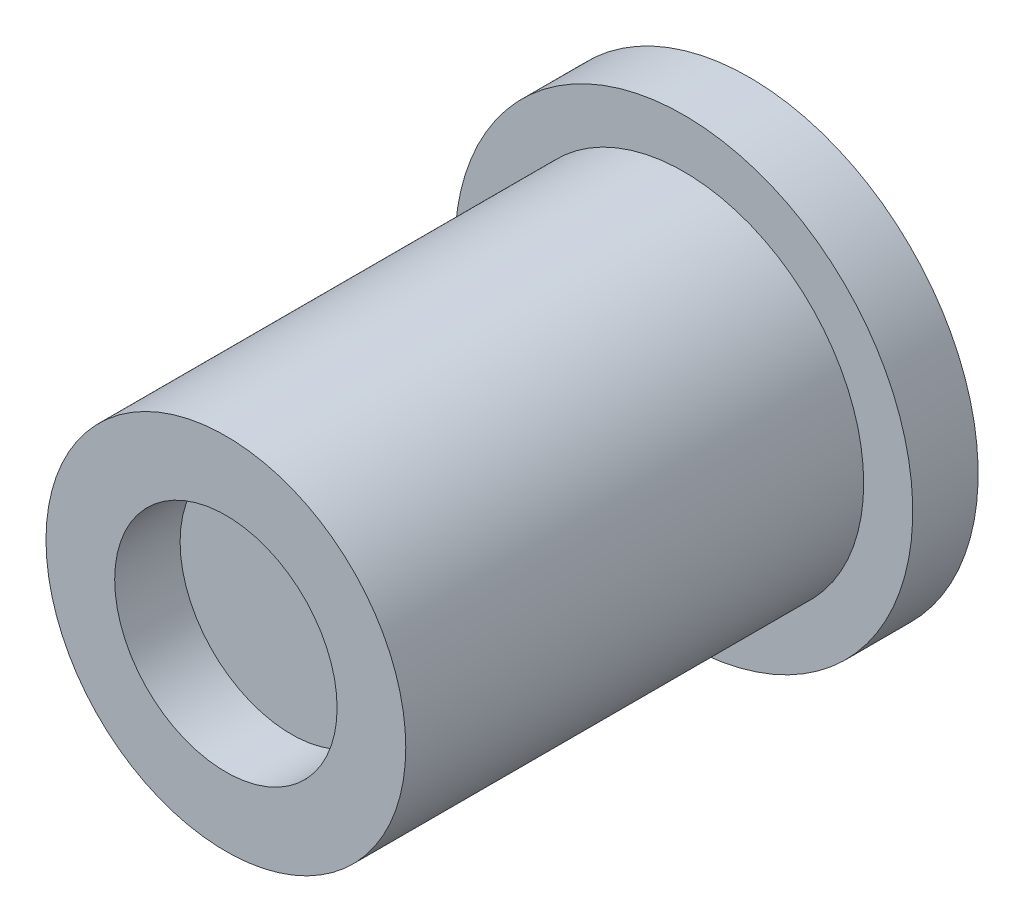
ISO-10303-21;
HEADER;
FILE_DESCRIPTION(('STEP AP214'),'2;1');
FILE_NAME('part.step','',(''),(''),'','','');
FILE_SCHEMA(('AUTOMOTIVE_DESIGN { 1 0 10303 214 1 1 1 1 }'));
ENDSEC;
DATA;
#1=APPLICATION_CONTEXT('core data for automotive mechanical design processes');
#2=APPLICATION_PROTOCOL_DEFINITION('international standard','automotive_design',2000,#1);
#3=PRODUCT_CONTEXT('',#1,'mechanical');
#4=PRODUCT('Part','Part','',(#3));
#5=PRODUCT_RELATED_PRODUCT_CATEGORY('part','',(#4));
#6=PRODUCT_DEFINITION_FORMATION('','',#4);
#7=PRODUCT_DEFINITION_CONTEXT('part definition',#1,'design');
#8=PRODUCT_DEFINITION('design','',#6,#7);
#9=PRODUCT_DEFINITION_SHAPE('','',#8);
#10=(LENGTH_UNIT() NAMED_UNIT(*) SI_UNIT(.MILLI.,.METRE.));
#11=(NAMED_UNIT(*) PLANE_ANGLE_UNIT() SI_UNIT($,.RADIAN.));
#12=(NAMED_UNIT(*) SI_UNIT($,.STERADIAN.) SOLID_ANGLE_UNIT());
#13=UNCERTAINTY_MEASURE_WITH_UNIT(LENGTH_MEASURE(1.E-05),#10,'distance_accuracy_value','');
#14=(GEOMETRIC_REPRESENTATION_CONTEXT(3) GLOBAL_UNCERTAINTY_ASSIGNED_CONTEXT((#13)) GLOBAL_UNIT_ASSIGNED_CONTEXT((#10,
#11,#12)) REPRESENTATION_CONTEXT('',''));
#15=CARTESIAN_POINT('',(0.,0.,0.));
#16=DIRECTION('',(0.,0.,1.));
#17=DIRECTION('',(1.,0.,0.));
#18=AXIS2_PLACEMENT_3D('',#15,#16,#17);
#19=CARTESIAN_POINT('',(0.,0.,2.));
#20=DIRECTION('',(0.,0.,1.));
#21=DIRECTION('',(1.,0.,0.));
#22=AXIS2_PLACEMENT_3D('',#19,#20,#21);
#23=PLANE('',#22);
#24=CARTESIAN_POINT('',(0.,0.,2.));
#25=DIRECTION('',(0.,0.,1.));
#26=DIRECTION('',(1.,0.,0.));
#27=AXIS2_PLACEMENT_3D('',#24,#25,#26);
#28=CIRCLE('',#27,5.5);
#29=CARTESIAN_POINT('',(5.5,0.,2.));
#30=VERTEX_POINT('',#29);
#31=EDGE_CURVE('E10',#30,#30,#28,.T.);
#32=ORIENTED_EDGE('',*,*,#31,.T.);
#33=EDGE_LOOP('',(#32));
#34=FACE_BOUND('',#33,.T.);
#35=CARTESIAN_POINT('',(0.,0.,2.));
#36=DIRECTION('',(0.,0.,1.));
#37=DIRECTION('',(1.,0.,0.));
#38=AXIS2_PLACEMENT_3D('',#35,#36,#37);
#39=CIRCLE('',#38,3.4);
#40=CARTESIAN_POINT('',(3.4,0.,2.));
#41=VERTEX_POINT('',#40);
#42=EDGE_CURVE('E40',#41,#41,#39,.T.);
#43=ORIENTED_EDGE('',*,*,#42,.F.);
#44=EDGE_LOOP('',(#43));
#45=FACE_BOUND('',#44,.T.);
#46=ADVANCED_FACE('F33',(#34,#45),#23,.T.);
#47=CARTESIAN_POINT('',(0.,0.,2.));
#48=DIRECTION('',(0.,0.,-1.));
#49=DIRECTION('',(-1.,0.,0.));
#50=AXIS2_PLACEMENT_3D('',#47,#48,#49);
#51=CYLINDRICAL_SURFACE('',#50,5.5);
#52=ORIENTED_EDGE('',*,*,#31,.F.);
#53=EDGE_LOOP('',(#52));
#54=FACE_BOUND('',#53,.T.);
#55=CARTESIAN_POINT('',(0.,0.,-12.));
#56=DIRECTION('',(0.,0.,-1.));
#57=DIRECTION('',(-1.,0.,0.));
#58=AXIS2_PLACEMENT_3D('',#55,#56,#57);
#59=CIRCLE('',#58,5.5);
#60=CARTESIAN_POINT('',(-5.5,0.,-12.));
#61=VERTEX_POINT('',#60);
#62=EDGE_CURVE('E49',#61,#61,#59,.T.);
#63=ORIENTED_EDGE('',*,*,#62,.F.);
#64=EDGE_LOOP('',(#63));
#65=FACE_BOUND('',#64,.T.);
#66=ADVANCED_FACE('F35',(#54,#65),#51,.T.);
#67=CARTESIAN_POINT('',(0.,0.,2.));
#68=DIRECTION('',(0.,0.,-1.));
#69=DIRECTION('',(-1.,0.,0.));
#70=AXIS2_PLACEMENT_3D('',#67,#68,#69);
#71=CYLINDRICAL_SURFACE('',#70,3.4);
#72=ORIENTED_EDGE('',*,*,#42,.T.);
#73=EDGE_LOOP('',(#72));
#74=FACE_BOUND('',#73,.T.);
#75=CARTESIAN_POINT('',(0.,0.,0.));
#76=DIRECTION('',(0.,0.,1.));
#77=DIRECTION('',(1.,0.,0.));
#78=AXIS2_PLACEMENT_3D('',#75,#76,#77);
#79=CIRCLE('',#78,3.4);
#80=CARTESIAN_POINT('',(3.4,0.,0.));
#81=VERTEX_POINT('',#80);
#82=EDGE_CURVE('E44',#81,#81,#79,.T.);
#83=ORIENTED_EDGE('',*,*,#82,.F.);
#84=EDGE_LOOP('',(#83));
#85=FACE_BOUND('',#84,.T.);
#86=ADVANCED_FACE('F81',(#74,#85),#71,.F.);
#87=CARTESIAN_POINT('',(0.,0.,0.));
#88=DIRECTION('',(0.,0.,-1.));
#89=DIRECTION('',(-1.,0.,0.));
#90=AXIS2_PLACEMENT_3D('',#87,#88,#89);
#91=PLANE('',#90);
#92=ORIENTED_EDGE('',*,*,#82,.T.);
#93=EDGE_LOOP('',(#92));
#94=FACE_BOUND('',#93,.T.);
#95=ADVANCED_FACE('F65',(#94),#91,.F.);
#96=CARTESIAN_POINT('',(0.,0.,-14.));
#97=DIRECTION('',(0.,0.,1.));
#98=DIRECTION('',(1.,0.,0.));
#99=AXIS2_PLACEMENT_3D('',#96,#97,#98);
#100=CYLINDRICAL_SURFACE('',#99,7.);
#101=CARTESIAN_POINT('',(0.,0.,-14.));
#102=DIRECTION('',(0.,0.,-1.));
#103=DIRECTION('',(-1.,0.,0.));
#104=AXIS2_PLACEMENT_3D('',#101,#102,#103);
#105=CIRCLE('',#104,7.);
#106=CARTESIAN_POINT('',(-7.,0.,-14.));
#107=VERTEX_POINT('',#106);
#108=EDGE_CURVE('E53',#107,#107,#105,.T.);
#109=ORIENTED_EDGE('',*,*,#108,.F.);
#110=EDGE_LOOP('',(#109));
#111=FACE_BOUND('',#110,.T.);
#112=CARTESIAN_POINT('',(0.,0.,-12.));
#113=DIRECTION('',(0.,0.,-1.));
#114=DIRECTION('',(-1.,0.,0.));
#115=AXIS2_PLACEMENT_3D('',#112,#113,#114);
#116=CIRCLE('',#115,7.);
#117=CARTESIAN_POINT('',(-7.,0.,-12.));
#118=VERTEX_POINT('',#117);
#119=EDGE_CURVE('E54',#118,#118,#116,.T.);
#120=ORIENTED_EDGE('',*,*,#119,.T.);
#121=EDGE_LOOP('',(#120));
#122=FACE_BOUND('',#121,.T.);
#123=ADVANCED_FACE('F62',(#111,#122),#100,.T.);
#124=CARTESIAN_POINT('',(0.,0.,-14.));
#125=DIRECTION('',(0.,0.,-1.));
#126=DIRECTION('',(-1.,0.,0.));
#127=AXIS2_PLACEMENT_3D('',#124,#125,#126);
#128=PLANE('',#127);
#129=ORIENTED_EDGE('',*,*,#108,.T.);
#130=EDGE_LOOP('',(#129));
#131=FACE_BOUND('',#130,.T.);
#132=ADVANCED_FACE('F60',(#131),#128,.T.);
#133=CARTESIAN_POINT('',(0.,0.,-12.));
#134=DIRECTION('',(0.,0.,-1.));
#135=DIRECTION('',(-1.,0.,0.));
#136=AXIS2_PLACEMENT_3D('',#133,#134,#135);
#137=PLANE('',#136);
#138=ORIENTED_EDGE('',*,*,#62,.T.);
#139=EDGE_LOOP('',(#138));
#140=FACE_BOUND('',#139,.T.);
#141=ORIENTED_EDGE('',*,*,#119,.F.);
#142=EDGE_LOOP('',(#141));
#143=FACE_BOUND('',#142,.T.);
#144=ADVANCED_FACE('F69',(#140,#143),#137,.F.);
#145=CLOSED_SHELL('',(#46,#66,#86,#95,#123,#132,#144));
#146=MANIFOLD_SOLID_BREP('B2',#145);
#147=ADVANCED_BREP_SHAPE_REPRESENTATION('',(#18,#146),#14);
#148=SHAPE_DEFINITION_REPRESENTATION(#9,#147);
ENDSEC;
END-ISO-10303-21;
